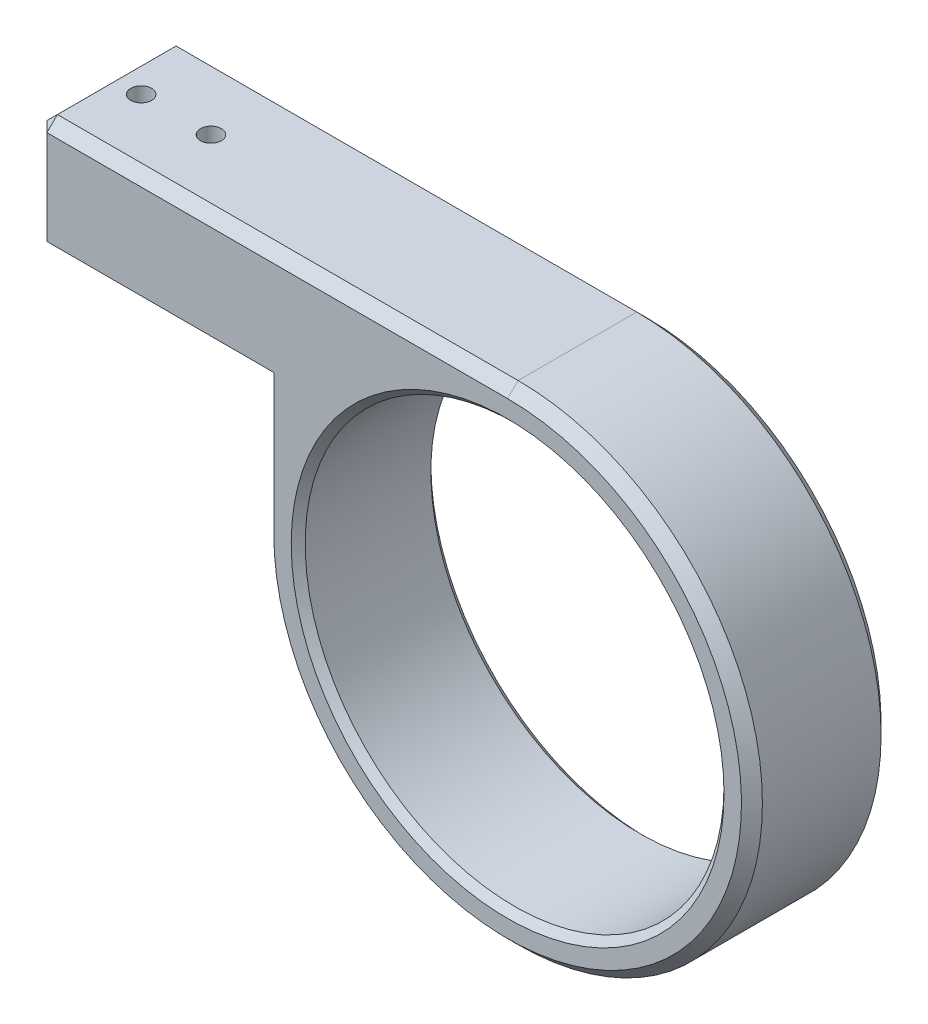
ISO-10303-21;
HEADER;
FILE_DESCRIPTION(('STEP AP214'),'2;1');
FILE_NAME('part.step','',(''),(''),'','','');
FILE_SCHEMA(('AUTOMOTIVE_DESIGN { 1 0 10303 214 1 1 1 1 }'));
ENDSEC;
DATA;
#1=APPLICATION_CONTEXT('core data for automotive mechanical design processes');
#2=APPLICATION_PROTOCOL_DEFINITION('international standard','automotive_design',2000,#1);
#3=PRODUCT_CONTEXT('',#1,'mechanical');
#4=PRODUCT('Part','Part','',(#3));
#5=PRODUCT_RELATED_PRODUCT_CATEGORY('part','',(#4));
#6=PRODUCT_DEFINITION_FORMATION('','',#4);
#7=PRODUCT_DEFINITION_CONTEXT('part definition',#1,'design');
#8=PRODUCT_DEFINITION('design','',#6,#7);
#9=PRODUCT_DEFINITION_SHAPE('','',#8);
#10=(LENGTH_UNIT() NAMED_UNIT(*) SI_UNIT(.MILLI.,.METRE.));
#11=(NAMED_UNIT(*) PLANE_ANGLE_UNIT() SI_UNIT($,.RADIAN.));
#12=(NAMED_UNIT(*) SI_UNIT($,.STERADIAN.) SOLID_ANGLE_UNIT());
#13=UNCERTAINTY_MEASURE_WITH_UNIT(LENGTH_MEASURE(1.E-05),#10,'distance_accuracy_value','');
#14=(GEOMETRIC_REPRESENTATION_CONTEXT(3) GLOBAL_UNCERTAINTY_ASSIGNED_CONTEXT((#13)) GLOBAL_UNIT_ASSIGNED_CONTEXT((#10,
#11,#12)) REPRESENTATION_CONTEXT('',''));
#15=CARTESIAN_POINT('',(0.,0.,0.));
#16=DIRECTION('',(0.,0.,1.));
#17=DIRECTION('',(1.,0.,0.));
#18=AXIS2_PLACEMENT_3D('',#15,#16,#17);
#19=CARTESIAN_POINT('',(0.,0.,20.));
#20=DIRECTION('',(0.,0.,-1.));
#21=DIRECTION('',(-1.,0.,0.));
#22=AXIS2_PLACEMENT_3D('',#19,#20,#21);
#23=CYLINDRICAL_SURFACE('',#22,35.);
#24=DIRECTION('',(0.,0.,1.));
#25=VECTOR('',#24,1.);
#26=CARTESIAN_POINT('',(-35.,0.,20.));
#27=LINE('',#26,#25);
#28=CARTESIAN_POINT('',(-35.,0.,1.5));
#29=VERTEX_POINT('',#28);
#30=CARTESIAN_POINT('',(-35.,0.,18.5));
#31=VERTEX_POINT('',#30);
#32=EDGE_CURVE('E256',#29,#31,#27,.T.);
#33=ORIENTED_EDGE('',*,*,#32,.F.);
#34=CARTESIAN_POINT('',(0.,0.,1.5));
#35=DIRECTION('',(0.,0.,1.));
#36=DIRECTION('',(1.,0.,0.));
#37=AXIS2_PLACEMENT_3D('',#34,#35,#36);
#38=CIRCLE('',#37,35.);
#39=CARTESIAN_POINT('',(0.,35.,1.5));
#40=VERTEX_POINT('',#39);
#41=EDGE_CURVE('E194',#29,#40,#38,.T.);
#42=ORIENTED_EDGE('',*,*,#41,.T.);
#43=DIRECTION('',(0.,0.,-1.));
#44=VECTOR('',#43,1.);
#45=CARTESIAN_POINT('',(0.,35.,20.));
#46=LINE('',#45,#44);
#47=CARTESIAN_POINT('',(0.,35.,18.5));
#48=VERTEX_POINT('',#47);
#49=EDGE_CURVE('E263',#40,#48,#46,.F.);
#50=ORIENTED_EDGE('',*,*,#49,.T.);
#51=CARTESIAN_POINT('',(0.,0.,18.5));
#52=DIRECTION('',(0.,0.,1.));
#53=DIRECTION('',(1.,0.,0.));
#54=AXIS2_PLACEMENT_3D('',#51,#52,#53);
#55=CIRCLE('',#54,35.);
#56=EDGE_CURVE('E57',#48,#31,#55,.F.);
#57=ORIENTED_EDGE('',*,*,#56,.T.);
#58=EDGE_LOOP('',(#33,#42,#50,#57));
#59=FACE_BOUND('',#58,.T.);
#60=ADVANCED_FACE('F39',(#59),#23,.T.);
#61=CARTESIAN_POINT('',(0.,0.,20.));
#62=DIRECTION('',(0.,0.,1.));
#63=DIRECTION('',(1.,0.,0.));
#64=AXIS2_PLACEMENT_3D('',#61,#62,#63);
#65=PLANE('',#64);
#66=CARTESIAN_POINT('',(0.,0.,20.));
#67=DIRECTION('',(0.,0.,1.));
#68=DIRECTION('',(1.,0.,0.));
#69=AXIS2_PLACEMENT_3D('',#66,#67,#68);
#70=CIRCLE('',#69,31.);
#71=CARTESIAN_POINT('',(31.,0.,20.));
#72=VERTEX_POINT('',#71);
#73=EDGE_CURVE('E268',#72,#72,#70,.F.);
#74=ORIENTED_EDGE('',*,*,#73,.T.);
#75=EDGE_LOOP('',(#74));
#76=FACE_BOUND('',#75,.T.);
#77=DIRECTION('',(-1.,0.,0.));
#78=VECTOR('',#77,1.);
#79=CARTESIAN_POINT('',(0.,33.5,20.));
#80=LINE('',#79,#78);
#81=CARTESIAN_POINT('',(0.,33.5,20.));
#82=VERTEX_POINT('',#81);
#83=CARTESIAN_POINT('',(-66.,33.5,20.));
#84=VERTEX_POINT('',#83);
#85=EDGE_CURVE('E291',#82,#84,#80,.T.);
#86=ORIENTED_EDGE('',*,*,#85,.T.);
#87=DIRECTION('',(0.,-1.,0.));
#88=VECTOR('',#87,1.);
#89=CARTESIAN_POINT('',(-66.,0.,20.));
#90=LINE('',#89,#88);
#91=CARTESIAN_POINT('',(-66.,20.,20.));
#92=VERTEX_POINT('',#91);
#93=EDGE_CURVE('E157',#84,#92,#90,.T.);
#94=ORIENTED_EDGE('',*,*,#93,.T.);
#95=DIRECTION('',(-1.,0.,0.));
#96=VECTOR('',#95,1.);
#97=CARTESIAN_POINT('',(35.001,20.,20.));
#98=LINE('',#97,#96);
#99=CARTESIAN_POINT('',(-33.5,20.,20.));
#100=VERTEX_POINT('',#99);
#101=EDGE_CURVE('E260',#100,#92,#98,.T.);
#102=ORIENTED_EDGE('',*,*,#101,.F.);
#103=DIRECTION('',(0.,-1.,0.));
#104=VECTOR('',#103,1.);
#105=CARTESIAN_POINT('',(-33.5,0.,20.));
#106=LINE('',#105,#104);
#107=CARTESIAN_POINT('',(-33.5,0.,20.));
#108=VERTEX_POINT('',#107);
#109=EDGE_CURVE('E163',#100,#108,#106,.T.);
#110=ORIENTED_EDGE('',*,*,#109,.T.);
#111=CARTESIAN_POINT('',(0.,0.,20.));
#112=DIRECTION('',(0.,0.,1.));
#113=DIRECTION('',(1.,0.,0.));
#114=AXIS2_PLACEMENT_3D('',#111,#112,#113);
#115=CIRCLE('',#114,33.5);
#116=EDGE_CURVE('E288',#108,#82,#115,.T.);
#117=ORIENTED_EDGE('',*,*,#116,.T.);
#118=EDGE_LOOP('',(#86,#94,#102,#110,#117));
#119=FACE_BOUND('',#118,.T.);
#120=ADVANCED_FACE('F297',(#76,#119),#65,.T.);
#121=CARTESIAN_POINT('',(0.,0.,0.));
#122=DIRECTION('',(0.,0.,1.));
#123=DIRECTION('',(1.,0.,0.));
#124=AXIS2_PLACEMENT_3D('',#121,#122,#123);
#125=PLANE('',#124);
#126=CARTESIAN_POINT('',(0.,0.,0.));
#127=DIRECTION('',(0.,0.,1.));
#128=DIRECTION('',(1.,0.,0.));
#129=AXIS2_PLACEMENT_3D('',#126,#127,#128);
#130=CIRCLE('',#129,31.);
#131=CARTESIAN_POINT('',(31.,0.,0.));
#132=VERTEX_POINT('',#131);
#133=EDGE_CURVE('E140',#132,#132,#130,.T.);
#134=ORIENTED_EDGE('',*,*,#133,.T.);
#135=EDGE_LOOP('',(#134));
#136=FACE_BOUND('',#135,.T.);
#137=DIRECTION('',(0.,1.,0.));
#138=VECTOR('',#137,1.);
#139=CARTESIAN_POINT('',(-33.5,20.,0.));
#140=LINE('',#139,#138);
#141=CARTESIAN_POINT('',(-33.5,0.,0.));
#142=VERTEX_POINT('',#141);
#143=CARTESIAN_POINT('',(-33.5,20.,0.));
#144=VERTEX_POINT('',#143);
#145=EDGE_CURVE('E181',#142,#144,#140,.T.);
#146=ORIENTED_EDGE('',*,*,#145,.T.);
#147=DIRECTION('',(-1.,0.,0.));
#148=VECTOR('',#147,1.);
#149=CARTESIAN_POINT('',(35.001,20.,0.));
#150=LINE('',#149,#148);
#151=CARTESIAN_POINT('',(-66.,20.,0.));
#152=VERTEX_POINT('',#151);
#153=EDGE_CURVE('E150',#144,#152,#150,.T.);
#154=ORIENTED_EDGE('',*,*,#153,.T.);
#155=DIRECTION('',(0.,1.,0.));
#156=VECTOR('',#155,1.);
#157=CARTESIAN_POINT('',(-66.,35.,0.));
#158=LINE('',#157,#156);
#159=CARTESIAN_POINT('',(-66.,33.5,0.));
#160=VERTEX_POINT('',#159);
#161=EDGE_CURVE('E155',#152,#160,#158,.T.);
#162=ORIENTED_EDGE('',*,*,#161,.T.);
#163=DIRECTION('',(1.,0.,0.));
#164=VECTOR('',#163,1.);
#165=CARTESIAN_POINT('',(0.,33.5,0.));
#166=LINE('',#165,#164);
#167=CARTESIAN_POINT('',(0.,33.5,0.));
#168=VERTEX_POINT('',#167);
#169=EDGE_CURVE('E178',#160,#168,#166,.T.);
#170=ORIENTED_EDGE('',*,*,#169,.T.);
#171=CARTESIAN_POINT('',(0.,0.,0.));
#172=DIRECTION('',(0.,0.,1.));
#173=DIRECTION('',(1.,0.,0.));
#174=AXIS2_PLACEMENT_3D('',#171,#172,#173);
#175=CIRCLE('',#174,33.5);
#176=EDGE_CURVE('E175',#168,#142,#175,.F.);
#177=ORIENTED_EDGE('',*,*,#176,.T.);
#178=EDGE_LOOP('',(#146,#154,#162,#170,#177));
#179=FACE_BOUND('',#178,.T.);
#180=ADVANCED_FACE('F328',(#136,#179),#125,.F.);
#181=CARTESIAN_POINT('',(0.,0.,20.));
#182=DIRECTION('',(0.,0.,-1.));
#183=DIRECTION('',(-1.,0.,0.));
#184=AXIS2_PLACEMENT_3D('',#181,#182,#183);
#185=CYLINDRICAL_SURFACE('',#184,30.);
#186=CARTESIAN_POINT('',(0.,0.,19.));
#187=DIRECTION('',(0.,0.,1.));
#188=DIRECTION('',(1.,0.,0.));
#189=AXIS2_PLACEMENT_3D('',#186,#187,#188);
#190=CIRCLE('',#189,30.);
#191=CARTESIAN_POINT('',(30.,0.,19.));
#192=VERTEX_POINT('',#191);
#193=EDGE_CURVE('E276',#192,#192,#190,.T.);
#194=ORIENTED_EDGE('',*,*,#193,.T.);
#195=EDGE_LOOP('',(#194));
#196=FACE_BOUND('',#195,.T.);
#197=CARTESIAN_POINT('',(0.,0.,0.999999999999997));
#198=DIRECTION('',(0.,0.,1.));
#199=DIRECTION('',(1.,0.,0.));
#200=AXIS2_PLACEMENT_3D('',#197,#198,#199);
#201=CIRCLE('',#200,30.);
#202=CARTESIAN_POINT('',(30.,0.,0.999999999999997));
#203=VERTEX_POINT('',#202);
#204=EDGE_CURVE('E272',#203,#203,#201,.F.);
#205=ORIENTED_EDGE('',*,*,#204,.T.);
#206=EDGE_LOOP('',(#205));
#207=FACE_BOUND('',#206,.T.);
#208=ADVANCED_FACE('F343',(#196,#207),#185,.F.);
#209=CARTESIAN_POINT('',(35.001,20.,20.));
#210=DIRECTION('',(0.,-1.,0.));
#211=DIRECTION('',(0.,0.,-1.));
#212=AXIS2_PLACEMENT_3D('',#209,#210,#211);
#213=PLANE('',#212);
#214=CARTESIAN_POINT('',(-62.5,20.,10.));
#215=DIRECTION('',(0.,-1.,0.));
#216=DIRECTION('',(0.,0.,-1.));
#217=AXIS2_PLACEMENT_3D('',#214,#215,#216);
#218=CIRCLE('',#217,1.5);
#219=CARTESIAN_POINT('',(-62.5,20.,8.5));
#220=VERTEX_POINT('',#219);
#221=EDGE_CURVE('E250',#220,#220,#218,.T.);
#222=ORIENTED_EDGE('',*,*,#221,.F.);
#223=EDGE_LOOP('',(#222));
#224=FACE_BOUND('',#223,.T.);
#225=CARTESIAN_POINT('',(-52.5,20.,10.));
#226=DIRECTION('',(0.,-1.,0.));
#227=DIRECTION('',(0.,0.,-1.));
#228=AXIS2_PLACEMENT_3D('',#225,#226,#227);
#229=CIRCLE('',#228,1.5);
#230=CARTESIAN_POINT('',(-52.5,20.,8.5));
#231=VERTEX_POINT('',#230);
#232=EDGE_CURVE('E237',#231,#231,#229,.T.);
#233=ORIENTED_EDGE('',*,*,#232,.F.);
#234=EDGE_LOOP('',(#233));
#235=FACE_BOUND('',#234,.T.);
#236=ORIENTED_EDGE('',*,*,#101,.T.);
#237=DIRECTION('',(0.707106781186548,0.,0.707106781186548));
#238=VECTOR('',#237,1.);
#239=CARTESIAN_POINT('',(-15.4995,20.,70.5005));
#240=LINE('',#239,#238);
#241=CARTESIAN_POINT('',(-67.5,20.,18.5));
#242=VERTEX_POINT('',#241);
#243=EDGE_CURVE('E148',#92,#242,#240,.F.);
#244=ORIENTED_EDGE('',*,*,#243,.T.);
#245=DIRECTION('',(0.,0.,1.));
#246=VECTOR('',#245,1.);
#247=CARTESIAN_POINT('',(-67.5,20.,20.));
#248=LINE('',#247,#246);
#249=CARTESIAN_POINT('',(-67.5,20.,1.49999999999999));
#250=VERTEX_POINT('',#249);
#251=EDGE_CURVE('E131',#250,#242,#248,.T.);
#252=ORIENTED_EDGE('',*,*,#251,.F.);
#253=DIRECTION('',(0.707106781186548,0.,-0.707106781186548));
#254=VECTOR('',#253,1.);
#255=CARTESIAN_POINT('',(-25.4995,20.,-40.5005));
#256=LINE('',#255,#254);
#257=EDGE_CURVE('E145',#250,#152,#256,.T.);
#258=ORIENTED_EDGE('',*,*,#257,.T.);
#259=ORIENTED_EDGE('',*,*,#153,.F.);
#260=DIRECTION('',(-0.707106781186549,0.,0.707106781186546));
#261=VECTOR('',#260,1.);
#262=CARTESIAN_POINT('',(-35.,20.,1.5));
#263=LINE('',#262,#261);
#264=CARTESIAN_POINT('',(-35.,20.,1.5));
#265=VERTEX_POINT('',#264);
#266=EDGE_CURVE('E49',#144,#265,#263,.T.);
#267=ORIENTED_EDGE('',*,*,#266,.T.);
#268=DIRECTION('',(0.,0.,-1.));
#269=VECTOR('',#268,1.);
#270=CARTESIAN_POINT('',(-35.,20.,20.));
#271=LINE('',#270,#269);
#272=CARTESIAN_POINT('',(-35.,20.,18.5));
#273=VERTEX_POINT('',#272);
#274=EDGE_CURVE('E151',#273,#265,#271,.T.);
#275=ORIENTED_EDGE('',*,*,#274,.F.);
#276=DIRECTION('',(-0.707106781186546,0.,-0.707106781186549));
#277=VECTOR('',#276,1.);
#278=CARTESIAN_POINT('',(-35.,20.,18.4999999999999));
#279=LINE('',#278,#277);
#280=EDGE_CURVE('E11',#273,#100,#279,.F.);
#281=ORIENTED_EDGE('',*,*,#280,.T.);
#282=EDGE_LOOP('',(#236,#244,#252,#258,#259,#267,#275,#281));
#283=FACE_BOUND('',#282,.T.);
#284=ADVANCED_FACE('F144',(#224,#235,#283),#213,.T.);
#285=CARTESIAN_POINT('',(35.001,35.,20.));
#286=DIRECTION('',(0.,1.,0.));
#287=DIRECTION('',(0.,0.,1.));
#288=AXIS2_PLACEMENT_3D('',#285,#286,#287);
#289=PLANE('',#288);
#290=CARTESIAN_POINT('',(-62.5,35.,9.99999999999999));
#291=DIRECTION('',(0.,-1.,0.));
#292=DIRECTION('',(0.,0.,-1.));
#293=AXIS2_PLACEMENT_3D('',#290,#291,#292);
#294=CIRCLE('',#293,1.5);
#295=CARTESIAN_POINT('',(-62.5,35.,8.49999999999999));
#296=VERTEX_POINT('',#295);
#297=EDGE_CURVE('E258',#296,#296,#294,.T.);
#298=ORIENTED_EDGE('',*,*,#297,.T.);
#299=EDGE_LOOP('',(#298));
#300=FACE_BOUND('',#299,.T.);
#301=CARTESIAN_POINT('',(-52.5,35.,9.99999999999999));
#302=DIRECTION('',(0.,-1.,0.));
#303=DIRECTION('',(0.,0.,-1.));
#304=AXIS2_PLACEMENT_3D('',#301,#302,#303);
#305=CIRCLE('',#304,1.5);
#306=CARTESIAN_POINT('',(-52.5,35.,8.49999999999999));
#307=VERTEX_POINT('',#306);
#308=EDGE_CURVE('E244',#307,#307,#305,.T.);
#309=ORIENTED_EDGE('',*,*,#308,.T.);
#310=EDGE_LOOP('',(#309));
#311=FACE_BOUND('',#310,.T.);
#312=ORIENTED_EDGE('',*,*,#49,.F.);
#313=DIRECTION('',(-1.,0.,0.));
#314=VECTOR('',#313,1.);
#315=CARTESIAN_POINT('',(-67.5,35.,1.5));
#316=LINE('',#315,#314);
#317=CARTESIAN_POINT('',(-66.,35.,1.5));
#318=VERTEX_POINT('',#317);
#319=EDGE_CURVE('E172',#40,#318,#316,.T.);
#320=ORIENTED_EDGE('',*,*,#319,.T.);
#321=DIRECTION('',(0.,0.,1.));
#322=VECTOR('',#321,1.);
#323=CARTESIAN_POINT('',(-66.,35.,20.));
#324=LINE('',#323,#322);
#325=CARTESIAN_POINT('',(-66.,35.,18.5));
#326=VERTEX_POINT('',#325);
#327=EDGE_CURVE('E169',#318,#326,#324,.T.);
#328=ORIENTED_EDGE('',*,*,#327,.T.);
#329=DIRECTION('',(1.,0.,0.));
#330=VECTOR('',#329,1.);
#331=CARTESIAN_POINT('',(35.001,35.,18.5));
#332=LINE('',#331,#330);
#333=EDGE_CURVE('E161',#326,#48,#332,.T.);
#334=ORIENTED_EDGE('',*,*,#333,.T.);
#335=EDGE_LOOP('',(#312,#320,#328,#334));
#336=FACE_BOUND('',#335,.T.);
#337=ADVANCED_FACE('F333',(#300,#311,#336),#289,.T.);
#338=CARTESIAN_POINT('',(-67.5,0.,0.));
#339=DIRECTION('',(-1.,0.,0.));
#340=DIRECTION('',(0.,0.,1.));
#341=AXIS2_PLACEMENT_3D('',#338,#339,#340);
#342=PLANE('',#341);
#343=ORIENTED_EDGE('',*,*,#251,.T.);
#344=DIRECTION('',(0.,1.,0.));
#345=VECTOR('',#344,1.);
#346=CARTESIAN_POINT('',(-67.5,0.,18.5));
#347=LINE('',#346,#345);
#348=CARTESIAN_POINT('',(-67.5,33.5,18.5));
#349=VERTEX_POINT('',#348);
#350=EDGE_CURVE('E285',#242,#349,#347,.T.);
#351=ORIENTED_EDGE('',*,*,#350,.T.);
#352=DIRECTION('',(0.,0.,-1.));
#353=VECTOR('',#352,1.);
#354=CARTESIAN_POINT('',(-67.5,33.5,0.));
#355=LINE('',#354,#353);
#356=CARTESIAN_POINT('',(-67.5,33.5,1.49999999999999));
#357=VERTEX_POINT('',#356);
#358=EDGE_CURVE('E134',#349,#357,#355,.T.);
#359=ORIENTED_EDGE('',*,*,#358,.T.);
#360=DIRECTION('',(0.,-1.,0.));
#361=VECTOR('',#360,1.);
#362=CARTESIAN_POINT('',(-67.5,20.,1.49999999999999));
#363=LINE('',#362,#361);
#364=EDGE_CURVE('E127',#357,#250,#363,.T.);
#365=ORIENTED_EDGE('',*,*,#364,.T.);
#366=EDGE_LOOP('',(#343,#351,#359,#365));
#367=FACE_BOUND('',#366,.T.);
#368=ADVANCED_FACE('F129',(#367),#342,.T.);
#369=CARTESIAN_POINT('',(-35.,0.,0.));
#370=DIRECTION('',(-1.,0.,0.));
#371=DIRECTION('',(0.,0.,1.));
#372=AXIS2_PLACEMENT_3D('',#369,#370,#371);
#373=PLANE('',#372);
#374=ORIENTED_EDGE('',*,*,#274,.T.);
#375=DIRECTION('',(0.,-1.,0.));
#376=VECTOR('',#375,1.);
#377=CARTESIAN_POINT('',(-35.,0.,1.5));
#378=LINE('',#377,#376);
#379=EDGE_CURVE('E64',#265,#29,#378,.T.);
#380=ORIENTED_EDGE('',*,*,#379,.T.);
#381=ORIENTED_EDGE('',*,*,#32,.T.);
#382=DIRECTION('',(0.,1.,0.));
#383=VECTOR('',#382,1.);
#384=CARTESIAN_POINT('',(-35.,0.,18.5));
#385=LINE('',#384,#383);
#386=EDGE_CURVE('E187',#31,#273,#385,.T.);
#387=ORIENTED_EDGE('',*,*,#386,.T.);
#388=EDGE_LOOP('',(#374,#380,#381,#387));
#389=FACE_BOUND('',#388,.T.);
#390=ADVANCED_FACE('F341',(#389),#373,.T.);
#391=CARTESIAN_POINT('',(-52.5,35.,9.99999999999999));
#392=DIRECTION('',(0.,-1.,0.));
#393=DIRECTION('',(0.,0.,-1.));
#394=AXIS2_PLACEMENT_3D('',#391,#392,#393);
#395=CYLINDRICAL_SURFACE('',#394,1.5);
#396=ORIENTED_EDGE('',*,*,#308,.F.);
#397=EDGE_LOOP('',(#396));
#398=FACE_BOUND('',#397,.T.);
#399=ORIENTED_EDGE('',*,*,#232,.T.);
#400=EDGE_LOOP('',(#399));
#401=FACE_BOUND('',#400,.T.);
#402=ADVANCED_FACE('F392',(#398,#401),#395,.F.);
#403=CARTESIAN_POINT('',(-62.5,35.,9.99999999999999));
#404=DIRECTION('',(0.,-1.,0.));
#405=DIRECTION('',(0.,0.,-1.));
#406=AXIS2_PLACEMENT_3D('',#403,#404,#405);
#407=CYLINDRICAL_SURFACE('',#406,1.5);
#408=ORIENTED_EDGE('',*,*,#297,.F.);
#409=EDGE_LOOP('',(#408));
#410=FACE_BOUND('',#409,.T.);
#411=ORIENTED_EDGE('',*,*,#221,.T.);
#412=EDGE_LOOP('',(#411));
#413=FACE_BOUND('',#412,.T.);
#414=ADVANCED_FACE('F361',(#410,#413),#407,.F.);
#415=CARTESIAN_POINT('',(0.,0.,20.));
#416=DIRECTION('',(0.,0.,1.));
#417=DIRECTION('',(1.,0.,0.));
#418=AXIS2_PLACEMENT_3D('',#415,#416,#417);
#419=CONICAL_SURFACE('',#418,31.,0.785398163397447);
#420=ORIENTED_EDGE('',*,*,#193,.F.);
#421=EDGE_LOOP('',(#420));
#422=FACE_BOUND('',#421,.T.);
#423=ORIENTED_EDGE('',*,*,#73,.F.);
#424=EDGE_LOOP('',(#423));
#425=FACE_BOUND('',#424,.T.);
#426=ADVANCED_FACE('F357',(#422,#425),#419,.F.);
#427=CARTESIAN_POINT('',(0.,0.,0.999999999999997));
#428=DIRECTION('',(0.,0.,-1.));
#429=DIRECTION('',(-1.,0.,0.));
#430=AXIS2_PLACEMENT_3D('',#427,#428,#429);
#431=CONICAL_SURFACE('',#430,30.,0.785398163397452);
#432=ORIENTED_EDGE('',*,*,#133,.F.);
#433=EDGE_LOOP('',(#432));
#434=FACE_BOUND('',#433,.T.);
#435=ORIENTED_EDGE('',*,*,#204,.F.);
#436=EDGE_LOOP('',(#435));
#437=FACE_BOUND('',#436,.T.);
#438=ADVANCED_FACE('F360',(#434,#437),#431,.F.);
#439=CARTESIAN_POINT('',(-35.,0.,1.5));
#440=DIRECTION('',(-0.707106781186546,0.,-0.707106781186549));
#441=DIRECTION('',(0.,1.,0.));
#442=AXIS2_PLACEMENT_3D('',#439,#440,#441);
#443=PLANE('',#442);
#444=ORIENTED_EDGE('',*,*,#266,.F.);
#445=ORIENTED_EDGE('',*,*,#145,.F.);
#446=DIRECTION('',(0.707106781186549,0.,-0.707106781186546));
#447=VECTOR('',#446,1.);
#448=CARTESIAN_POINT('',(-35.,0.,1.5));
#449=LINE('',#448,#447);
#450=EDGE_CURVE('E43',#29,#142,#449,.T.);
#451=ORIENTED_EDGE('',*,*,#450,.F.);
#452=ORIENTED_EDGE('',*,*,#379,.F.);
#453=EDGE_LOOP('',(#444,#445,#451,#452));
#454=FACE_BOUND('',#453,.T.);
#455=ADVANCED_FACE('F41',(#454),#443,.T.);
#456=CARTESIAN_POINT('',(0.,0.,1.5));
#457=DIRECTION('',(0.,0.,1.));
#458=DIRECTION('',(1.,0.,0.));
#459=AXIS2_PLACEMENT_3D('',#456,#457,#458);
#460=CONICAL_SURFACE('',#459,35.,0.785398163397451);
#461=ORIENTED_EDGE('',*,*,#450,.T.);
#462=ORIENTED_EDGE('',*,*,#176,.F.);
#463=DIRECTION('',(0.,-0.707106781186549,-0.707106781186546));
#464=VECTOR('',#463,1.);
#465=CARTESIAN_POINT('',(0.,35.,1.5));
#466=LINE('',#465,#464);
#467=EDGE_CURVE('E228',#40,#168,#466,.T.);
#468=ORIENTED_EDGE('',*,*,#467,.F.);
#469=ORIENTED_EDGE('',*,*,#41,.F.);
#470=EDGE_LOOP('',(#461,#462,#468,#469));
#471=FACE_BOUND('',#470,.T.);
#472=ADVANCED_FACE('F330',(#471),#460,.T.);
#473=CARTESIAN_POINT('',(-67.5,0.,1.49999999999999));
#474=DIRECTION('',(-0.707106781186548,0.,-0.707106781186548));
#475=DIRECTION('',(0.,1.,0.));
#476=AXIS2_PLACEMENT_3D('',#473,#474,#475);
#477=PLANE('',#476);
#478=ORIENTED_EDGE('',*,*,#257,.F.);
#479=ORIENTED_EDGE('',*,*,#364,.F.);
#480=DIRECTION('',(-0.707106781186547,0.,0.707106781186547));
#481=VECTOR('',#480,1.);
#482=CARTESIAN_POINT('',(-67.5,33.5,1.49999999999999));
#483=LINE('',#482,#481);
#484=EDGE_CURVE('E226',#160,#357,#483,.T.);
#485=ORIENTED_EDGE('',*,*,#484,.F.);
#486=ORIENTED_EDGE('',*,*,#161,.F.);
#487=EDGE_LOOP('',(#478,#479,#485,#486));
#488=FACE_BOUND('',#487,.T.);
#489=ADVANCED_FACE('F154',(#488),#477,.T.);
#490=CARTESIAN_POINT('',(35.001,35.,1.5));
#491=DIRECTION('',(0.,0.707106781186544,-0.707106781186551));
#492=DIRECTION('',(1.,0.,0.));
#493=AXIS2_PLACEMENT_3D('',#490,#491,#492);
#494=PLANE('',#493);
#495=ORIENTED_EDGE('',*,*,#467,.T.);
#496=ORIENTED_EDGE('',*,*,#169,.F.);
#497=DIRECTION('',(0.,-0.707106781186551,-0.707106781186544));
#498=VECTOR('',#497,1.);
#499=CARTESIAN_POINT('',(-66.,34.25,0.750000000000008));
#500=LINE('',#499,#498);
#501=EDGE_CURVE('E222',#318,#160,#500,.T.);
#502=ORIENTED_EDGE('',*,*,#501,.F.);
#503=ORIENTED_EDGE('',*,*,#319,.F.);
#504=EDGE_LOOP('',(#495,#496,#502,#503));
#505=FACE_BOUND('',#504,.T.);
#506=ADVANCED_FACE('F326',(#505),#494,.T.);
#507=CARTESIAN_POINT('',(-35.,0.,18.5));
#508=DIRECTION('',(0.707106781186549,0.,-0.707106781186546));
#509=DIRECTION('',(0.,1.,0.));
#510=AXIS2_PLACEMENT_3D('',#507,#508,#509);
#511=PLANE('',#510);
#512=ORIENTED_EDGE('',*,*,#280,.F.);
#513=ORIENTED_EDGE('',*,*,#386,.F.);
#514=DIRECTION('',(-0.707106781186546,0.,-0.707106781186549));
#515=VECTOR('',#514,1.);
#516=CARTESIAN_POINT('',(-33.5,0.,20.));
#517=LINE('',#516,#515);
#518=EDGE_CURVE('E218',#108,#31,#517,.T.);
#519=ORIENTED_EDGE('',*,*,#518,.F.);
#520=ORIENTED_EDGE('',*,*,#109,.F.);
#521=EDGE_LOOP('',(#512,#513,#519,#520));
#522=FACE_BOUND('',#521,.T.);
#523=ADVANCED_FACE('F303',(#522),#511,.F.);
#524=CARTESIAN_POINT('',(-67.5,33.5,1.49999999999999));
#525=DIRECTION('',(-0.577350269189622,0.577350269189622,-0.577350269189633));
#526=DIRECTION('',(-0.707106781186554,0.,0.707106781186541));
#527=AXIS2_PLACEMENT_3D('',#524,#525,#526);
#528=PLANE('',#527);
#529=ORIENTED_EDGE('',*,*,#501,.T.);
#530=ORIENTED_EDGE('',*,*,#484,.T.);
#531=DIRECTION('',(-0.707106781186544,-0.707106781186551,0.));
#532=VECTOR('',#531,1.);
#533=CARTESIAN_POINT('',(-67.5,33.5,1.49999999999999));
#534=LINE('',#533,#532);
#535=EDGE_CURVE('E214',#318,#357,#534,.T.);
#536=ORIENTED_EDGE('',*,*,#535,.F.);
#537=EDGE_LOOP('',(#529,#530,#536));
#538=FACE_BOUND('',#537,.T.);
#539=ADVANCED_FACE('F324',(#538),#528,.T.);
#540=CARTESIAN_POINT('',(0.,0.,20.));
#541=DIRECTION('',(0.,0.,-1.));
#542=DIRECTION('',(-1.,0.,0.));
#543=AXIS2_PLACEMENT_3D('',#540,#541,#542);
#544=CONICAL_SURFACE('',#543,33.5,0.785398163397446);
#545=ORIENTED_EDGE('',*,*,#518,.T.);
#546=ORIENTED_EDGE('',*,*,#56,.F.);
#547=DIRECTION('',(0.,0.707106781186546,-0.707106781186549));
#548=VECTOR('',#547,1.);
#549=CARTESIAN_POINT('',(0.,33.5,20.));
#550=LINE('',#549,#548);
#551=EDGE_CURVE('E210',#82,#48,#550,.T.);
#552=ORIENTED_EDGE('',*,*,#551,.F.);
#553=ORIENTED_EDGE('',*,*,#116,.F.);
#554=EDGE_LOOP('',(#545,#546,#552,#553));
#555=FACE_BOUND('',#554,.T.);
#556=ADVANCED_FACE('F305',(#555),#544,.T.);
#557=CARTESIAN_POINT('',(-67.5,33.5,0.));
#558=DIRECTION('',(0.707106781186551,-0.707106781186544,0.));
#559=DIRECTION('',(0.,0.,-1.));
#560=AXIS2_PLACEMENT_3D('',#557,#558,#559);
#561=PLANE('',#560);
#562=ORIENTED_EDGE('',*,*,#535,.T.);
#563=ORIENTED_EDGE('',*,*,#358,.F.);
#564=DIRECTION('',(0.707106781186544,0.707106781186551,0.));
#565=VECTOR('',#564,1.);
#566=CARTESIAN_POINT('',(-67.5,33.5,18.5));
#567=LINE('',#566,#565);
#568=EDGE_CURVE('E206',#326,#349,#567,.F.);
#569=ORIENTED_EDGE('',*,*,#568,.F.);
#570=ORIENTED_EDGE('',*,*,#327,.F.);
#571=EDGE_LOOP('',(#562,#563,#569,#570));
#572=FACE_BOUND('',#571,.T.);
#573=ADVANCED_FACE('F321',(#572),#561,.F.);
#574=CARTESIAN_POINT('',(0.,33.5,20.));
#575=DIRECTION('',(0.,-0.707106781186549,-0.707106781186546));
#576=DIRECTION('',(-1.,0.,0.));
#577=AXIS2_PLACEMENT_3D('',#574,#575,#576);
#578=PLANE('',#577);
#579=ORIENTED_EDGE('',*,*,#551,.T.);
#580=ORIENTED_EDGE('',*,*,#333,.F.);
#581=DIRECTION('',(0.,-0.707106781186546,0.707106781186549));
#582=VECTOR('',#581,1.);
#583=CARTESIAN_POINT('',(-66.,34.25,19.25));
#584=LINE('',#583,#582);
#585=EDGE_CURVE('E202',#84,#326,#584,.F.);
#586=ORIENTED_EDGE('',*,*,#585,.F.);
#587=ORIENTED_EDGE('',*,*,#85,.F.);
#588=EDGE_LOOP('',(#579,#580,#586,#587));
#589=FACE_BOUND('',#588,.T.);
#590=ADVANCED_FACE('F310',(#589),#578,.F.);
#591=CARTESIAN_POINT('',(-67.5,33.5,18.5));
#592=DIRECTION('',(-0.577350269189612,0.577350269189631,0.577350269189634));
#593=DIRECTION('',(0.,-0.707106781186549,0.707106781186546));
#594=AXIS2_PLACEMENT_3D('',#591,#592,#593);
#595=PLANE('',#594);
#596=ORIENTED_EDGE('',*,*,#585,.T.);
#597=ORIENTED_EDGE('',*,*,#568,.T.);
#598=DIRECTION('',(-0.707106781186548,0.,-0.707106781186548));
#599=VECTOR('',#598,1.);
#600=CARTESIAN_POINT('',(-67.5,33.5,18.5));
#601=LINE('',#600,#599);
#602=EDGE_CURVE('E199',#84,#349,#601,.T.);
#603=ORIENTED_EDGE('',*,*,#602,.F.);
#604=EDGE_LOOP('',(#596,#597,#603));
#605=FACE_BOUND('',#604,.T.);
#606=ADVANCED_FACE('F318',(#605),#595,.T.);
#607=CARTESIAN_POINT('',(-67.5,0.,18.5));
#608=DIRECTION('',(0.707106781186548,0.,-0.707106781186548));
#609=DIRECTION('',(0.,1.,0.));
#610=AXIS2_PLACEMENT_3D('',#607,#608,#609);
#611=PLANE('',#610);
#612=ORIENTED_EDGE('',*,*,#243,.F.);
#613=ORIENTED_EDGE('',*,*,#93,.F.);
#614=ORIENTED_EDGE('',*,*,#602,.T.);
#615=ORIENTED_EDGE('',*,*,#350,.F.);
#616=EDGE_LOOP('',(#612,#613,#614,#615));
#617=FACE_BOUND('',#616,.T.);
#618=ADVANCED_FACE('F315',(#617),#611,.F.);
#619=CLOSED_SHELL('',(#60,#120,#180,#208,#284,#337,#368,#390,#402,#414,#426,#438,#455,#472,#489,
#506,#523,#539,#556,#573,#590,#606,#618));
#620=MANIFOLD_SOLID_BREP('B2',#619);
#621=ADVANCED_BREP_SHAPE_REPRESENTATION('',(#18,#620),#14);
#622=SHAPE_DEFINITION_REPRESENTATION(#9,#621);
ENDSEC;
END-ISO-10303-21;
